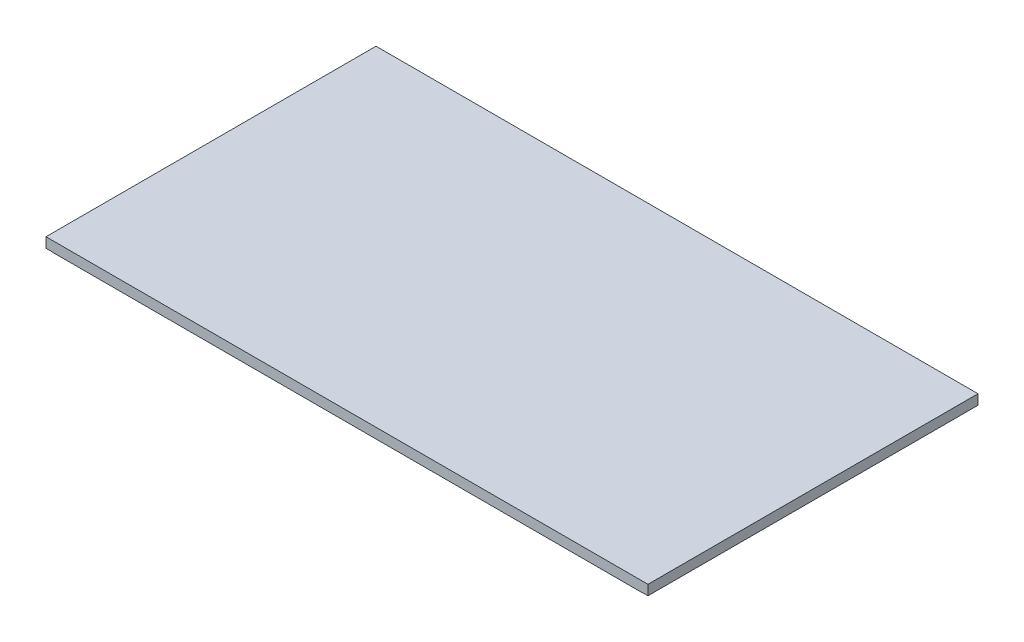
ISO-10303-21;
HEADER;
FILE_DESCRIPTION(('STEP AP214'),'2;1');
FILE_NAME('part.step','',(''),(''),'','','');
FILE_SCHEMA(('AUTOMOTIVE_DESIGN { 1 0 10303 214 1 1 1 1 }'));
ENDSEC;
DATA;
#1=APPLICATION_CONTEXT('core data for automotive mechanical design processes');
#2=APPLICATION_PROTOCOL_DEFINITION('international standard','automotive_design',2000,#1);
#3=PRODUCT_CONTEXT('',#1,'mechanical');
#4=PRODUCT('Part','Part','',(#3));
#5=PRODUCT_RELATED_PRODUCT_CATEGORY('part','',(#4));
#6=PRODUCT_DEFINITION_FORMATION('','',#4);
#7=PRODUCT_DEFINITION_CONTEXT('part definition',#1,'design');
#8=PRODUCT_DEFINITION('design','',#6,#7);
#9=PRODUCT_DEFINITION_SHAPE('','',#8);
#10=(LENGTH_UNIT() NAMED_UNIT(*) SI_UNIT(.MILLI.,.METRE.));
#11=(NAMED_UNIT(*) PLANE_ANGLE_UNIT() SI_UNIT($,.RADIAN.));
#12=(NAMED_UNIT(*) SI_UNIT($,.STERADIAN.) SOLID_ANGLE_UNIT());
#13=UNCERTAINTY_MEASURE_WITH_UNIT(LENGTH_MEASURE(1.E-05),#10,'distance_accuracy_value','');
#14=(GEOMETRIC_REPRESENTATION_CONTEXT(3) GLOBAL_UNCERTAINTY_ASSIGNED_CONTEXT((#13)) GLOBAL_UNIT_ASSIGNED_CONTEXT((#10,
#11,#12)) REPRESENTATION_CONTEXT('',''));
#15=CARTESIAN_POINT('',(0.,0.,0.));
#16=DIRECTION('',(0.,0.,1.));
#17=DIRECTION('',(1.,0.,0.));
#18=AXIS2_PLACEMENT_3D('',#15,#16,#17);
#19=CARTESIAN_POINT('',(147.75,5.,81.));
#20=DIRECTION('',(-1.,0.,0.));
#21=DIRECTION('',(0.,0.,1.));
#22=AXIS2_PLACEMENT_3D('',#19,#20,#21);
#23=PLANE('',#22);
#24=DIRECTION('',(0.,0.,1.));
#25=VECTOR('',#24,1.);
#26=CARTESIAN_POINT('',(147.75,0.1,81.));
#27=LINE('',#26,#25);
#28=CARTESIAN_POINT('',(147.75,0.1,-81.));
#29=VERTEX_POINT('',#28);
#30=CARTESIAN_POINT('',(147.75,0.1,81.));
#31=VERTEX_POINT('',#30);
#32=EDGE_CURVE('E135',#29,#31,#27,.T.);
#33=ORIENTED_EDGE('',*,*,#32,.F.);
#34=DIRECTION('',(0.,-1.,0.));
#35=VECTOR('',#34,1.);
#36=CARTESIAN_POINT('',(147.75,5.,-81.));
#37=LINE('',#36,#35);
#38=CARTESIAN_POINT('',(147.75,5.,-81.));
#39=VERTEX_POINT('',#38);
#40=EDGE_CURVE('E182',#39,#29,#37,.T.);
#41=ORIENTED_EDGE('',*,*,#40,.F.);
#42=DIRECTION('',(0.,0.,-1.));
#43=VECTOR('',#42,1.);
#44=CARTESIAN_POINT('',(147.75,5.,81.));
#45=LINE('',#44,#43);
#46=CARTESIAN_POINT('',(147.75,5.,81.));
#47=VERTEX_POINT('',#46);
#48=EDGE_CURVE('E161',#47,#39,#45,.T.);
#49=ORIENTED_EDGE('',*,*,#48,.F.);
#50=DIRECTION('',(0.,-1.,0.));
#51=VECTOR('',#50,1.);
#52=CARTESIAN_POINT('',(147.75,5.,81.));
#53=LINE('',#52,#51);
#54=EDGE_CURVE('E47',#47,#31,#53,.T.);
#55=ORIENTED_EDGE('',*,*,#54,.T.);
#56=EDGE_LOOP('',(#33,#41,#49,#55));
#57=FACE_BOUND('',#56,.T.);
#58=ADVANCED_FACE('F38',(#57),#23,.F.);
#59=CARTESIAN_POINT('',(-147.75,5.,81.));
#60=DIRECTION('',(1.,0.,0.));
#61=DIRECTION('',(0.,0.,-1.));
#62=AXIS2_PLACEMENT_3D('',#59,#60,#61);
#63=PLANE('',#62);
#64=DIRECTION('',(0.,0.,-1.));
#65=VECTOR('',#64,1.);
#66=CARTESIAN_POINT('',(-147.75,0.1,81.));
#67=LINE('',#66,#65);
#68=CARTESIAN_POINT('',(-147.75,0.1,81.));
#69=VERTEX_POINT('',#68);
#70=CARTESIAN_POINT('',(-147.75,0.1,-81.));
#71=VERTEX_POINT('',#70);
#72=EDGE_CURVE('E11',#69,#71,#67,.T.);
#73=ORIENTED_EDGE('',*,*,#72,.F.);
#74=DIRECTION('',(0.,-1.,0.));
#75=VECTOR('',#74,1.);
#76=CARTESIAN_POINT('',(-147.75,5.,81.));
#77=LINE('',#76,#75);
#78=CARTESIAN_POINT('',(-147.75,5.,81.));
#79=VERTEX_POINT('',#78);
#80=EDGE_CURVE('E125',#79,#69,#77,.T.);
#81=ORIENTED_EDGE('',*,*,#80,.F.);
#82=DIRECTION('',(0.,0.,1.));
#83=VECTOR('',#82,1.);
#84=CARTESIAN_POINT('',(-147.75,5.,81.));
#85=LINE('',#84,#83);
#86=CARTESIAN_POINT('',(-147.75,5.,-81.));
#87=VERTEX_POINT('',#86);
#88=EDGE_CURVE('E168',#87,#79,#85,.T.);
#89=ORIENTED_EDGE('',*,*,#88,.F.);
#90=DIRECTION('',(0.,-1.,0.));
#91=VECTOR('',#90,1.);
#92=CARTESIAN_POINT('',(-147.75,5.,-81.));
#93=LINE('',#92,#91);
#94=EDGE_CURVE('E178',#87,#71,#93,.T.);
#95=ORIENTED_EDGE('',*,*,#94,.T.);
#96=EDGE_LOOP('',(#73,#81,#89,#95));
#97=FACE_BOUND('',#96,.T.);
#98=ADVANCED_FACE('F216',(#97),#63,.F.);
#99=CARTESIAN_POINT('',(147.75,5.,81.));
#100=DIRECTION('',(0.,0.,-1.));
#101=DIRECTION('',(-1.,0.,0.));
#102=AXIS2_PLACEMENT_3D('',#99,#100,#101);
#103=PLANE('',#102);
#104=DIRECTION('',(-1.,0.,0.));
#105=VECTOR('',#104,1.);
#106=CARTESIAN_POINT('',(-150.75,0.1,81.));
#107=LINE('',#106,#105);
#108=CARTESIAN_POINT('',(-144.75,0.1,81.));
#109=VERTEX_POINT('',#108);
#110=EDGE_CURVE('E117',#109,#69,#107,.T.);
#111=ORIENTED_EDGE('',*,*,#110,.F.);
#112=DIRECTION('',(0.,-1.,0.));
#113=VECTOR('',#112,1.);
#114=CARTESIAN_POINT('',(-144.75,0.1,81.));
#115=LINE('',#114,#113);
#116=CARTESIAN_POINT('',(-144.75,0.,81.));
#117=VERTEX_POINT('',#116);
#118=EDGE_CURVE('E103',#109,#117,#115,.T.);
#119=ORIENTED_EDGE('',*,*,#118,.T.);
#120=DIRECTION('',(1.,0.,0.));
#121=VECTOR('',#120,1.);
#122=CARTESIAN_POINT('',(147.75,0.,81.));
#123=LINE('',#122,#121);
#124=CARTESIAN_POINT('',(144.75,0.,81.));
#125=VERTEX_POINT('',#124);
#126=EDGE_CURVE('E157',#117,#125,#123,.T.);
#127=ORIENTED_EDGE('',*,*,#126,.T.);
#128=DIRECTION('',(0.,-1.,0.));
#129=VECTOR('',#128,1.);
#130=CARTESIAN_POINT('',(144.75,0.1,81.));
#131=LINE('',#130,#129);
#132=CARTESIAN_POINT('',(144.75,0.1,81.));
#133=VERTEX_POINT('',#132);
#134=EDGE_CURVE('E62',#133,#125,#131,.T.);
#135=ORIENTED_EDGE('',*,*,#134,.F.);
#136=DIRECTION('',(-1.,0.,0.));
#137=VECTOR('',#136,1.);
#138=CARTESIAN_POINT('',(144.75,0.1,81.));
#139=LINE('',#138,#137);
#140=EDGE_CURVE('E137',#31,#133,#139,.T.);
#141=ORIENTED_EDGE('',*,*,#140,.F.);
#142=ORIENTED_EDGE('',*,*,#54,.F.);
#143=DIRECTION('',(1.,0.,0.));
#144=VECTOR('',#143,1.);
#145=CARTESIAN_POINT('',(-147.75,5.,81.));
#146=LINE('',#145,#144);
#147=EDGE_CURVE('E158',#79,#47,#146,.T.);
#148=ORIENTED_EDGE('',*,*,#147,.F.);
#149=ORIENTED_EDGE('',*,*,#80,.T.);
#150=EDGE_LOOP('',(#111,#119,#127,#135,#141,#142,#148,#149));
#151=FACE_BOUND('',#150,.T.);
#152=ADVANCED_FACE('F40',(#151),#103,.F.);
#153=CARTESIAN_POINT('',(-147.75,5.,-81.));
#154=DIRECTION('',(0.,0.,1.));
#155=DIRECTION('',(1.,0.,0.));
#156=AXIS2_PLACEMENT_3D('',#153,#154,#155);
#157=PLANE('',#156);
#158=DIRECTION('',(-1.,0.,0.));
#159=VECTOR('',#158,1.);
#160=CARTESIAN_POINT('',(-147.75,0.,-81.));
#161=LINE('',#160,#159);
#162=CARTESIAN_POINT('',(144.75,0.,-81.));
#163=VERTEX_POINT('',#162);
#164=CARTESIAN_POINT('',(-144.75,0.,-81.));
#165=VERTEX_POINT('',#164);
#166=EDGE_CURVE('E162',#163,#165,#161,.T.);
#167=ORIENTED_EDGE('',*,*,#166,.T.);
#168=DIRECTION('',(0.,-1.,0.));
#169=VECTOR('',#168,1.);
#170=CARTESIAN_POINT('',(-144.75,0.1,-81.));
#171=LINE('',#170,#169);
#172=CARTESIAN_POINT('',(-144.75,0.1,-81.));
#173=VERTEX_POINT('',#172);
#174=EDGE_CURVE('E54',#173,#165,#171,.T.);
#175=ORIENTED_EDGE('',*,*,#174,.F.);
#176=DIRECTION('',(1.,0.,0.));
#177=VECTOR('',#176,1.);
#178=CARTESIAN_POINT('',(-150.75,0.1,-81.));
#179=LINE('',#178,#177);
#180=EDGE_CURVE('E113',#71,#173,#179,.T.);
#181=ORIENTED_EDGE('',*,*,#180,.F.);
#182=ORIENTED_EDGE('',*,*,#94,.F.);
#183=DIRECTION('',(-1.,0.,0.));
#184=VECTOR('',#183,1.);
#185=CARTESIAN_POINT('',(147.75,5.,-81.));
#186=LINE('',#185,#184);
#187=EDGE_CURVE('E165',#39,#87,#186,.T.);
#188=ORIENTED_EDGE('',*,*,#187,.F.);
#189=ORIENTED_EDGE('',*,*,#40,.T.);
#190=DIRECTION('',(1.,0.,0.));
#191=VECTOR('',#190,1.);
#192=CARTESIAN_POINT('',(144.75,0.1,-81.));
#193=LINE('',#192,#191);
#194=CARTESIAN_POINT('',(144.75,0.1,-81.));
#195=VERTEX_POINT('',#194);
#196=EDGE_CURVE('E145',#195,#29,#193,.T.);
#197=ORIENTED_EDGE('',*,*,#196,.F.);
#198=DIRECTION('',(0.,-1.,0.));
#199=VECTOR('',#198,1.);
#200=CARTESIAN_POINT('',(144.75,0.1,-81.));
#201=LINE('',#200,#199);
#202=EDGE_CURVE('E133',#195,#163,#201,.T.);
#203=ORIENTED_EDGE('',*,*,#202,.T.);
#204=EDGE_LOOP('',(#167,#175,#181,#182,#188,#189,#197,#203));
#205=FACE_BOUND('',#204,.T.);
#206=ADVANCED_FACE('F199',(#205),#157,.F.);
#207=CARTESIAN_POINT('',(0.,5.,0.));
#208=DIRECTION('',(0.,-1.,0.));
#209=DIRECTION('',(0.,0.,-1.));
#210=AXIS2_PLACEMENT_3D('',#207,#208,#209);
#211=PLANE('',#210);
#212=ORIENTED_EDGE('',*,*,#147,.T.);
#213=ORIENTED_EDGE('',*,*,#48,.T.);
#214=ORIENTED_EDGE('',*,*,#187,.T.);
#215=ORIENTED_EDGE('',*,*,#88,.T.);
#216=EDGE_LOOP('',(#212,#213,#214,#215));
#217=FACE_BOUND('',#216,.T.);
#218=ADVANCED_FACE('F203',(#217),#211,.F.);
#219=CARTESIAN_POINT('',(0.,0.,0.));
#220=DIRECTION('',(0.,-1.,0.));
#221=DIRECTION('',(0.,0.,-1.));
#222=AXIS2_PLACEMENT_3D('',#219,#220,#221);
#223=PLANE('',#222);
#224=DIRECTION('',(0.,0.,1.));
#225=VECTOR('',#224,1.);
#226=CARTESIAN_POINT('',(-144.75,0.,81.));
#227=LINE('',#226,#225);
#228=EDGE_CURVE('E107',#165,#117,#227,.T.);
#229=ORIENTED_EDGE('',*,*,#228,.F.);
#230=ORIENTED_EDGE('',*,*,#166,.F.);
#231=DIRECTION('',(0.,0.,-1.));
#232=VECTOR('',#231,1.);
#233=CARTESIAN_POINT('',(144.75,0.,81.));
#234=LINE('',#233,#232);
#235=EDGE_CURVE('E141',#125,#163,#234,.T.);
#236=ORIENTED_EDGE('',*,*,#235,.F.);
#237=ORIENTED_EDGE('',*,*,#126,.F.);
#238=EDGE_LOOP('',(#229,#230,#236,#237));
#239=FACE_BOUND('',#238,.T.);
#240=ADVANCED_FACE('F201',(#239),#223,.T.);
#241=CARTESIAN_POINT('',(0.,0.1,0.));
#242=DIRECTION('',(0.,-1.,0.));
#243=DIRECTION('',(0.,0.,-1.));
#244=AXIS2_PLACEMENT_3D('',#241,#242,#243);
#245=PLANE('',#244);
#246=ORIENTED_EDGE('',*,*,#32,.T.);
#247=ORIENTED_EDGE('',*,*,#140,.T.);
#248=DIRECTION('',(0.,0.,-1.));
#249=VECTOR('',#248,1.);
#250=CARTESIAN_POINT('',(144.75,0.1,81.));
#251=LINE('',#250,#249);
#252=EDGE_CURVE('E140',#133,#195,#251,.T.);
#253=ORIENTED_EDGE('',*,*,#252,.T.);
#254=ORIENTED_EDGE('',*,*,#196,.T.);
#255=EDGE_LOOP('',(#246,#247,#253,#254));
#256=FACE_BOUND('',#255,.T.);
#257=ADVANCED_FACE('F194',(#256),#245,.T.);
#258=CARTESIAN_POINT('',(144.75,0.1,81.));
#259=DIRECTION('',(-1.,0.,0.));
#260=DIRECTION('',(0.,0.,1.));
#261=AXIS2_PLACEMENT_3D('',#258,#259,#260);
#262=PLANE('',#261);
#263=ORIENTED_EDGE('',*,*,#235,.T.);
#264=ORIENTED_EDGE('',*,*,#202,.F.);
#265=ORIENTED_EDGE('',*,*,#252,.F.);
#266=ORIENTED_EDGE('',*,*,#134,.T.);
#267=EDGE_LOOP('',(#263,#264,#265,#266));
#268=FACE_BOUND('',#267,.T.);
#269=ADVANCED_FACE('F196',(#268),#262,.F.);
#270=CARTESIAN_POINT('',(0.,0.1,0.));
#271=DIRECTION('',(0.,-1.,0.));
#272=DIRECTION('',(0.,0.,-1.));
#273=AXIS2_PLACEMENT_3D('',#270,#271,#272);
#274=PLANE('',#273);
#275=ORIENTED_EDGE('',*,*,#72,.T.);
#276=ORIENTED_EDGE('',*,*,#180,.T.);
#277=DIRECTION('',(0.,0.,1.));
#278=VECTOR('',#277,1.);
#279=CARTESIAN_POINT('',(-144.75,0.1,81.));
#280=LINE('',#279,#278);
#281=EDGE_CURVE('E106',#173,#109,#280,.T.);
#282=ORIENTED_EDGE('',*,*,#281,.T.);
#283=ORIENTED_EDGE('',*,*,#110,.T.);
#284=EDGE_LOOP('',(#275,#276,#282,#283));
#285=FACE_BOUND('',#284,.T.);
#286=ADVANCED_FACE('F116',(#285),#274,.T.);
#287=CARTESIAN_POINT('',(-144.75,0.1,81.));
#288=DIRECTION('',(1.,0.,0.));
#289=DIRECTION('',(0.,0.,-1.));
#290=AXIS2_PLACEMENT_3D('',#287,#288,#289);
#291=PLANE('',#290);
#292=ORIENTED_EDGE('',*,*,#228,.T.);
#293=ORIENTED_EDGE('',*,*,#118,.F.);
#294=ORIENTED_EDGE('',*,*,#281,.F.);
#295=ORIENTED_EDGE('',*,*,#174,.T.);
#296=EDGE_LOOP('',(#292,#293,#294,#295));
#297=FACE_BOUND('',#296,.T.);
#298=ADVANCED_FACE('F105',(#297),#291,.F.);
#299=CLOSED_SHELL('',(#58,#98,#152,#206,#218,#240,#257,#269,#286,#298));
#300=MANIFOLD_SOLID_BREP('B2',#299);
#301=ADVANCED_BREP_SHAPE_REPRESENTATION('',(#18,#300),#14);
#302=SHAPE_DEFINITION_REPRESENTATION(#9,#301);
ENDSEC;
END-ISO-10303-21;
